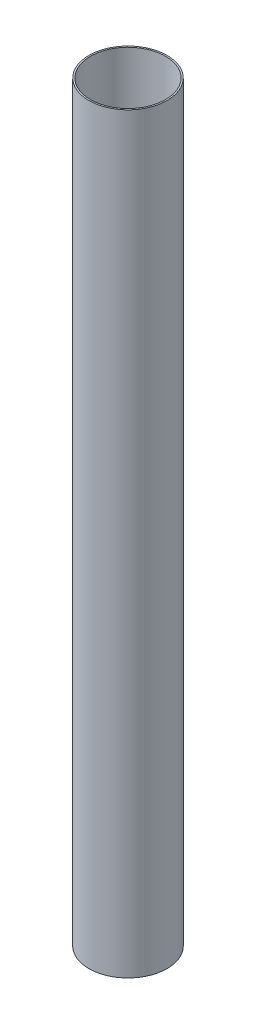
ISO-10303-21;
HEADER;
FILE_DESCRIPTION(('STEP AP214'),'2;1');
FILE_NAME('part.step','',(''),(''),'','','');
FILE_SCHEMA(('AUTOMOTIVE_DESIGN { 1 0 10303 214 1 1 1 1 }'));
ENDSEC;
DATA;
#1=APPLICATION_CONTEXT('core data for automotive mechanical design processes');
#2=APPLICATION_PROTOCOL_DEFINITION('international standard','automotive_design',2000,#1);
#3=PRODUCT_CONTEXT('',#1,'mechanical');
#4=PRODUCT('Part','Part','',(#3));
#5=PRODUCT_RELATED_PRODUCT_CATEGORY('part','',(#4));
#6=PRODUCT_DEFINITION_FORMATION('','',#4);
#7=PRODUCT_DEFINITION_CONTEXT('part definition',#1,'design');
#8=PRODUCT_DEFINITION('design','',#6,#7);
#9=PRODUCT_DEFINITION_SHAPE('','',#8);
#10=(LENGTH_UNIT() NAMED_UNIT(*) SI_UNIT(.MILLI.,.METRE.));
#11=(NAMED_UNIT(*) PLANE_ANGLE_UNIT() SI_UNIT($,.RADIAN.));
#12=(NAMED_UNIT(*) SI_UNIT($,.STERADIAN.) SOLID_ANGLE_UNIT());
#13=UNCERTAINTY_MEASURE_WITH_UNIT(LENGTH_MEASURE(1.E-05),#10,'distance_accuracy_value','');
#14=(GEOMETRIC_REPRESENTATION_CONTEXT(3) GLOBAL_UNCERTAINTY_ASSIGNED_CONTEXT((#13)) GLOBAL_UNIT_ASSIGNED_CONTEXT((#10,
#11,#12)) REPRESENTATION_CONTEXT('',''));
#15=CARTESIAN_POINT('',(0.,0.,0.));
#16=DIRECTION('',(0.,0.,1.));
#17=DIRECTION('',(1.,0.,0.));
#18=AXIS2_PLACEMENT_3D('',#15,#16,#17);
#19=CARTESIAN_POINT('',(0.,762.,0.));
#20=DIRECTION('',(0.,1.,0.));
#21=DIRECTION('',(0.,0.,1.));
#22=AXIS2_PLACEMENT_3D('',#19,#20,#21);
#23=PLANE('',#22);
#24=CARTESIAN_POINT('',(0.,762.,0.));
#25=DIRECTION('',(0.,1.,0.));
#26=DIRECTION('',(0.,0.,1.));
#27=AXIS2_PLACEMENT_3D('',#24,#25,#26);
#28=CIRCLE('',#27,39.624);
#29=CARTESIAN_POINT('',(0.,762.,39.624));
#30=VERTEX_POINT('',#29);
#31=EDGE_CURVE('E10',#30,#30,#28,.T.);
#32=ORIENTED_EDGE('',*,*,#31,.T.);
#33=EDGE_LOOP('',(#32));
#34=FACE_BOUND('',#33,.T.);
#35=CARTESIAN_POINT('',(0.,762.,0.));
#36=DIRECTION('',(0.,1.,0.));
#37=DIRECTION('',(0.,0.,1.));
#38=AXIS2_PLACEMENT_3D('',#35,#36,#37);
#39=CIRCLE('',#38,38.1);
#40=CARTESIAN_POINT('',(0.,762.,38.1));
#41=VERTEX_POINT('',#40);
#42=EDGE_CURVE('E56',#41,#41,#39,.T.);
#43=ORIENTED_EDGE('',*,*,#42,.F.);
#44=EDGE_LOOP('',(#43));
#45=FACE_BOUND('',#44,.T.);
#46=ADVANCED_FACE('F43',(#34,#45),#23,.T.);
#47=CARTESIAN_POINT('',(0.,0.,0.));
#48=DIRECTION('',(0.,1.,0.));
#49=DIRECTION('',(0.,0.,1.));
#50=AXIS2_PLACEMENT_3D('',#47,#48,#49);
#51=PLANE('',#50);
#52=CARTESIAN_POINT('',(0.,0.,0.));
#53=DIRECTION('',(0.,1.,0.));
#54=DIRECTION('',(0.,0.,1.));
#55=AXIS2_PLACEMENT_3D('',#52,#53,#54);
#56=CIRCLE('',#55,39.624);
#57=CARTESIAN_POINT('',(0.,0.,39.624));
#58=VERTEX_POINT('',#57);
#59=EDGE_CURVE('E47',#58,#58,#56,.T.);
#60=ORIENTED_EDGE('',*,*,#59,.F.);
#61=EDGE_LOOP('',(#60));
#62=FACE_BOUND('',#61,.T.);
#63=CARTESIAN_POINT('',(0.,0.,0.));
#64=DIRECTION('',(0.,1.,0.));
#65=DIRECTION('',(0.,0.,1.));
#66=AXIS2_PLACEMENT_3D('',#63,#64,#65);
#67=CIRCLE('',#66,38.1);
#68=CARTESIAN_POINT('',(0.,0.,38.1));
#69=VERTEX_POINT('',#68);
#70=EDGE_CURVE('E58',#69,#69,#67,.T.);
#71=ORIENTED_EDGE('',*,*,#70,.T.);
#72=EDGE_LOOP('',(#71));
#73=FACE_BOUND('',#72,.T.);
#74=ADVANCED_FACE('F70',(#62,#73),#51,.F.);
#75=CARTESIAN_POINT('',(0.,762.,0.));
#76=DIRECTION('',(0.,-1.,0.));
#77=DIRECTION('',(0.,0.,-1.));
#78=AXIS2_PLACEMENT_3D('',#75,#76,#77);
#79=CYLINDRICAL_SURFACE('',#78,39.624);
#80=ORIENTED_EDGE('',*,*,#31,.F.);
#81=EDGE_LOOP('',(#80));
#82=FACE_BOUND('',#81,.T.);
#83=ORIENTED_EDGE('',*,*,#59,.T.);
#84=EDGE_LOOP('',(#83));
#85=FACE_BOUND('',#84,.T.);
#86=ADVANCED_FACE('F45',(#82,#85),#79,.T.);
#87=CARTESIAN_POINT('',(0.,762.,0.));
#88=DIRECTION('',(0.,-1.,0.));
#89=DIRECTION('',(0.,0.,-1.));
#90=AXIS2_PLACEMENT_3D('',#87,#88,#89);
#91=CYLINDRICAL_SURFACE('',#90,38.1);
#92=ORIENTED_EDGE('',*,*,#42,.T.);
#93=EDGE_LOOP('',(#92));
#94=FACE_BOUND('',#93,.T.);
#95=ORIENTED_EDGE('',*,*,#70,.F.);
#96=EDGE_LOOP('',(#95));
#97=FACE_BOUND('',#96,.T.);
#98=ADVANCED_FACE('F66',(#94,#97),#91,.F.);
#99=CLOSED_SHELL('',(#46,#74,#86,#98));
#100=MANIFOLD_SOLID_BREP('B2',#99);
#101=ADVANCED_BREP_SHAPE_REPRESENTATION('',(#18,#100),#14);
#102=SHAPE_DEFINITION_REPRESENTATION(#9,#101);
ENDSEC;
END-ISO-10303-21;
